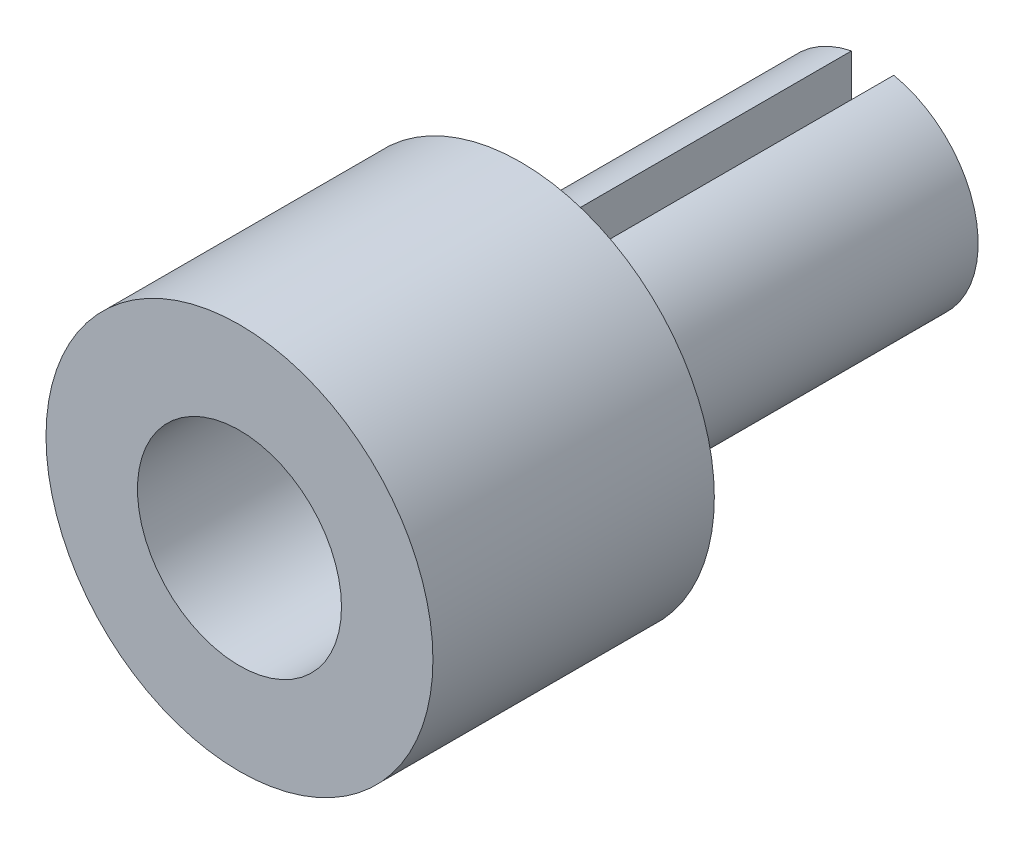
ISO-10303-21;
HEADER;
FILE_DESCRIPTION(('STEP AP214'),'2;1');
FILE_NAME('part.step','',(''),(''),'','','');
FILE_SCHEMA(('AUTOMOTIVE_DESIGN { 1 0 10303 214 1 1 1 1 }'));
ENDSEC;
DATA;
#1=APPLICATION_CONTEXT('core data for automotive mechanical design processes');
#2=APPLICATION_PROTOCOL_DEFINITION('international standard','automotive_design',2000,#1);
#3=PRODUCT_CONTEXT('',#1,'mechanical');
#4=PRODUCT('Part','Part','',(#3));
#5=PRODUCT_RELATED_PRODUCT_CATEGORY('part','',(#4));
#6=PRODUCT_DEFINITION_FORMATION('','',#4);
#7=PRODUCT_DEFINITION_CONTEXT('part definition',#1,'design');
#8=PRODUCT_DEFINITION('design','',#6,#7);
#9=PRODUCT_DEFINITION_SHAPE('','',#8);
#10=(LENGTH_UNIT() NAMED_UNIT(*) SI_UNIT(.MILLI.,.METRE.));
#11=(NAMED_UNIT(*) PLANE_ANGLE_UNIT() SI_UNIT($,.RADIAN.));
#12=(NAMED_UNIT(*) SI_UNIT($,.STERADIAN.) SOLID_ANGLE_UNIT());
#13=UNCERTAINTY_MEASURE_WITH_UNIT(LENGTH_MEASURE(1.E-05),#10,'distance_accuracy_value','');
#14=(GEOMETRIC_REPRESENTATION_CONTEXT(3) GLOBAL_UNCERTAINTY_ASSIGNED_CONTEXT((#13)) GLOBAL_UNIT_ASSIGNED_CONTEXT((#10,
#11,#12)) REPRESENTATION_CONTEXT('',''));
#15=CARTESIAN_POINT('',(0.,0.,0.));
#16=DIRECTION('',(0.,0.,1.));
#17=DIRECTION('',(1.,0.,0.));
#18=AXIS2_PLACEMENT_3D('',#15,#16,#17);
#19=CARTESIAN_POINT('',(10.,0.,0.999999999999999));
#20=DIRECTION('',(0.,0.,1.));
#21=DIRECTION('',(1.,0.,0.));
#22=AXIS2_PLACEMENT_3D('',#19,#20,#21);
#23=CYLINDRICAL_SURFACE('',#22,5.5);
#24=CARTESIAN_POINT('',(10.,0.,0.999999999999999));
#25=DIRECTION('',(0.,0.,-1.));
#26=DIRECTION('',(-1.,0.,0.));
#27=AXIS2_PLACEMENT_3D('',#24,#25,#26);
#28=CIRCLE('',#27,5.5);
#29=CARTESIAN_POINT('',(4.5,0.,0.999999999999999));
#30=VERTEX_POINT('',#29);
#31=EDGE_CURVE('E152',#30,#30,#28,.T.);
#32=ORIENTED_EDGE('',*,*,#31,.F.);
#33=EDGE_LOOP('',(#32));
#34=FACE_BOUND('',#33,.T.);
#35=CARTESIAN_POINT('',(10.,0.,9.));
#36=DIRECTION('',(0.,0.,-1.));
#37=DIRECTION('',(-1.,0.,0.));
#38=AXIS2_PLACEMENT_3D('',#35,#36,#37);
#39=CIRCLE('',#38,5.5);
#40=CARTESIAN_POINT('',(4.5,0.,9.));
#41=VERTEX_POINT('',#40);
#42=EDGE_CURVE('E151',#41,#41,#39,.T.);
#43=ORIENTED_EDGE('',*,*,#42,.T.);
#44=EDGE_LOOP('',(#43));
#45=FACE_BOUND('',#44,.T.);
#46=ADVANCED_FACE('F57',(#34,#45),#23,.T.);
#47=CARTESIAN_POINT('',(10.,0.,0.999999999999999));
#48=DIRECTION('',(0.,0.,-1.));
#49=DIRECTION('',(-1.,0.,0.));
#50=AXIS2_PLACEMENT_3D('',#47,#48,#49);
#51=PLANE('',#50);
#52=CARTESIAN_POINT('',(10.,0.,0.999999999999999));
#53=DIRECTION('',(0.,0.,-1.));
#54=DIRECTION('',(-1.,0.,0.));
#55=AXIS2_PLACEMENT_3D('',#52,#53,#54);
#56=CIRCLE('',#55,3.2);
#57=CARTESIAN_POINT('',(10.,-3.2,0.999999999999999));
#58=VERTEX_POINT('',#57);
#59=CARTESIAN_POINT('',(10.,3.2,0.999999999999999));
#60=VERTEX_POINT('',#59);
#61=EDGE_CURVE('E165',#58,#60,#56,.F.);
#62=ORIENTED_EDGE('',*,*,#61,.T.);
#63=CARTESIAN_POINT('',(10.,0.,0.999999999999999));
#64=DIRECTION('',(0.,0.,-1.));
#65=DIRECTION('',(-1.,0.,0.));
#66=AXIS2_PLACEMENT_3D('',#63,#64,#65);
#67=CIRCLE('',#66,3.2);
#68=EDGE_CURVE('E161',#60,#58,#67,.F.);
#69=ORIENTED_EDGE('',*,*,#68,.T.);
#70=EDGE_LOOP('',(#62,#69));
#71=FACE_BOUND('',#70,.T.);
#72=ORIENTED_EDGE('',*,*,#31,.T.);
#73=EDGE_LOOP('',(#72));
#74=FACE_BOUND('',#73,.T.);
#75=ADVANCED_FACE('F260',(#71,#74),#51,.T.);
#76=CARTESIAN_POINT('',(10.,0.,9.));
#77=DIRECTION('',(0.,0.,-1.));
#78=DIRECTION('',(-1.,0.,0.));
#79=AXIS2_PLACEMENT_3D('',#76,#77,#78);
#80=PLANE('',#79);
#81=CARTESIAN_POINT('',(10.,0.,9.));
#82=DIRECTION('',(0.,0.,1.));
#83=DIRECTION('',(1.,0.,0.));
#84=AXIS2_PLACEMENT_3D('',#81,#82,#83);
#85=CIRCLE('',#84,2.9);
#86=CARTESIAN_POINT('',(12.9,0.,9.));
#87=VERTEX_POINT('',#86);
#88=EDGE_CURVE('E401',#87,#87,#85,.T.);
#89=ORIENTED_EDGE('',*,*,#88,.F.);
#90=EDGE_LOOP('',(#89));
#91=FACE_BOUND('',#90,.T.);
#92=ORIENTED_EDGE('',*,*,#42,.F.);
#93=EDGE_LOOP('',(#92));
#94=FACE_BOUND('',#93,.T.);
#95=ADVANCED_FACE('F262',(#91,#94),#80,.F.);
#96=CARTESIAN_POINT('',(9.4,0.,-9.));
#97=DIRECTION('',(-1.,0.,0.));
#98=DIRECTION('',(0.,0.,1.));
#99=AXIS2_PLACEMENT_3D('',#96,#97,#98);
#100=PLANE('',#99);
#101=DIRECTION('',(0.,0.,1.));
#102=VECTOR('',#101,1.);
#103=CARTESIAN_POINT('',(9.4,2.93938769133981,-9.));
#104=LINE('',#103,#102);
#105=CARTESIAN_POINT('',(9.4,2.93938769133981,-9.));
#106=VERTEX_POINT('',#105);
#107=CARTESIAN_POINT('',(9.4,2.93938769133981,0.399999999999999));
#108=VERTEX_POINT('',#107);
#109=EDGE_CURVE('E143',#106,#108,#104,.T.);
#110=ORIENTED_EDGE('',*,*,#109,.T.);
#111=DIRECTION('',(0.,-1.,0.));
#112=VECTOR('',#111,1.);
#113=CARTESIAN_POINT('',(9.4,0.,0.399999999999999));
#114=LINE('',#113,#112);
#115=CARTESIAN_POINT('',(9.4,-2.93938769133982,0.399999999999999));
#116=VERTEX_POINT('',#115);
#117=EDGE_CURVE('E171',#108,#116,#114,.T.);
#118=ORIENTED_EDGE('',*,*,#117,.T.);
#119=DIRECTION('',(0.,0.,1.));
#120=VECTOR('',#119,1.);
#121=CARTESIAN_POINT('',(9.4,-2.93938769133982,-9.));
#122=LINE('',#121,#120);
#123=CARTESIAN_POINT('',(9.4,-2.93938769133982,-9.));
#124=VERTEX_POINT('',#123);
#125=EDGE_CURVE('E147',#124,#116,#122,.T.);
#126=ORIENTED_EDGE('',*,*,#125,.F.);
#127=DIRECTION('',(0.,-1.,0.));
#128=VECTOR('',#127,1.);
#129=CARTESIAN_POINT('',(9.4,0.,-9.));
#130=LINE('',#129,#128);
#131=EDGE_CURVE('E135',#106,#124,#130,.T.);
#132=ORIENTED_EDGE('',*,*,#131,.F.);
#133=EDGE_LOOP('',(#110,#118,#126,#132));
#134=FACE_BOUND('',#133,.T.);
#135=ADVANCED_FACE('F265',(#134),#100,.F.);
#136=CARTESIAN_POINT('',(10.,0.,-9.));
#137=DIRECTION('',(0.,0.,1.));
#138=DIRECTION('',(1.,0.,0.));
#139=AXIS2_PLACEMENT_3D('',#136,#137,#138);
#140=CYLINDRICAL_SURFACE('',#139,3.);
#141=ORIENTED_EDGE('',*,*,#125,.T.);
#142=CARTESIAN_POINT('',(9.4,-2.93938769133982,0.399999999999999));
#143=CARTESIAN_POINT('',(9.3999687418093,-2.93936518394346,0.433360551809369));
#144=CARTESIAN_POINT('',(9.40277992227454,-2.93995496401104,0.466706403486926));
#145=CARTESIAN_POINT('',(9.41386385694671,-2.94219328989964,0.53246197758734));
#146=CARTESIAN_POINT('',(9.422139482854,-2.94384239240823,0.564871198435304));
#147=CARTESIAN_POINT('',(9.44393153779739,-2.94803379990803,0.627818337847222));
#148=CARTESIAN_POINT('',(9.45744939717512,-2.95057634865796,0.658355743051161));
#149=CARTESIAN_POINT('',(9.48929643563222,-2.95625492194706,0.716670932051555));
#150=CARTESIAN_POINT('',(9.50761441192486,-2.9593895599402,0.744454936490346));
#151=CARTESIAN_POINT('',(9.53599053506304,-2.96390943206666,0.780606954961522));
#152=CARTESIAN_POINT('',(9.54423648289585,-2.9651903088908,0.790444702450846));
#153=CARTESIAN_POINT('',(9.55278640450004,-2.96647939483827,0.799999999999999));
#154=B_SPLINE_CURVE_WITH_KNOTS('',3,(#142,#143,#144,#145,#146,#147,#148,#149,#150,#151,#152,
#153),.UNSPECIFIED.,.F.,.F.,(4,2,2,2,2,4),(0.,0.099936791068292,0.19992614321977,
0.299942796649393,0.399728072895411,0.438400207243827),.UNSPECIFIED.);
#155=CARTESIAN_POINT('',(9.55278640450004,-2.96647939483827,0.799999999999999));
#156=VERTEX_POINT('',#155);
#157=EDGE_CURVE('E178',#116,#156,#154,.T.);
#158=ORIENTED_EDGE('',*,*,#157,.T.);
#159=CARTESIAN_POINT('',(10.,0.,0.799999999999999));
#160=DIRECTION('',(0.,0.,-1.));
#161=DIRECTION('',(-1.,0.,0.));
#162=AXIS2_PLACEMENT_3D('',#159,#160,#161);
#163=CIRCLE('',#162,3.);
#164=CARTESIAN_POINT('',(9.55278640450004,2.96647939483827,0.799999999999999));
#165=VERTEX_POINT('',#164);
#166=EDGE_CURVE('E168',#156,#165,#163,.T.);
#167=ORIENTED_EDGE('',*,*,#166,.T.);
#168=CARTESIAN_POINT('',(9.55278640450004,2.96647939483827,0.799999999999999));
#169=CARTESIAN_POINT('',(9.53042772305833,2.96310338419509,0.775042880070899));
#170=CARTESIAN_POINT('',(9.5101944090678,2.95979893442571,0.748172961665765));
#171=CARTESIAN_POINT('',(9.47441511024872,2.95365878628338,0.69134415154967));
#172=CARTESIAN_POINT('',(9.45887941477475,2.95082412294504,0.661378669243984));
#173=CARTESIAN_POINT('',(9.43301900781175,2.94596406138184,0.599176324228426));
#174=CARTESIAN_POINT('',(9.4227001029054,2.94393956543898,0.566936975841153));
#175=CARTESIAN_POINT('',(9.40764417994576,2.9409483248328,0.5012150949061));
#176=CARTESIAN_POINT('',(9.40289027583287,2.93997838094992,0.467736642837614));
#177=CARTESIAN_POINT('',(9.40032230832569,2.9394530168592,0.422759628621787));
#178=CARTESIAN_POINT('',(9.39999759084003,2.93938628444403,0.411376911916186));
#179=CARTESIAN_POINT('',(9.4,2.93938769133982,0.399999999999999));
#180=B_SPLINE_CURVE_WITH_KNOTS('',3,(#168,#169,#170,#171,#172,#173,#174,#175,#176,#177,#178,
#179),.UNSPECIFIED.,.F.,.F.,(4,2,2,2,2,4),(0.,0.100917908844464,0.202055286612998,
0.303304989512898,0.404246664243495,0.438388440221177),.UNSPECIFIED.);
#181=EDGE_CURVE('E217',#165,#108,#180,.T.);
#182=ORIENTED_EDGE('',*,*,#181,.T.);
#183=ORIENTED_EDGE('',*,*,#109,.F.);
#184=CARTESIAN_POINT('',(10.,0.,-9.));
#185=DIRECTION('',(0.,0.,-1.));
#186=DIRECTION('',(-1.,0.,0.));
#187=AXIS2_PLACEMENT_3D('',#184,#185,#186);
#188=CIRCLE('',#187,3.);
#189=EDGE_CURVE('E138',#124,#106,#188,.T.);
#190=ORIENTED_EDGE('',*,*,#189,.F.);
#191=EDGE_LOOP('',(#141,#158,#167,#182,#183,#190));
#192=FACE_BOUND('',#191,.T.);
#193=ADVANCED_FACE('F194',(#192),#140,.T.);
#194=CARTESIAN_POINT('',(10.,0.,-9.));
#195=DIRECTION('',(0.,0.,-1.));
#196=DIRECTION('',(-1.,0.,0.));
#197=AXIS2_PLACEMENT_3D('',#194,#195,#196);
#198=PLANE('',#197);
#199=ORIENTED_EDGE('',*,*,#131,.T.);
#200=ORIENTED_EDGE('',*,*,#189,.T.);
#201=EDGE_LOOP('',(#199,#200));
#202=FACE_BOUND('',#201,.T.);
#203=ADVANCED_FACE('F274',(#202),#198,.T.);
#204=CARTESIAN_POINT('',(10.6,0.,-9.));
#205=DIRECTION('',(1.,0.,0.));
#206=DIRECTION('',(0.,0.,-1.));
#207=AXIS2_PLACEMENT_3D('',#204,#205,#206);
#208=PLANE('',#207);
#209=DIRECTION('',(0.,0.,1.));
#210=VECTOR('',#209,1.);
#211=CARTESIAN_POINT('',(10.6,-2.93938769133981,-9.));
#212=LINE('',#211,#210);
#213=CARTESIAN_POINT('',(10.6,-2.93938769133981,-9.));
#214=VERTEX_POINT('',#213);
#215=CARTESIAN_POINT('',(10.6,-2.93938769133981,0.399999999999999));
#216=VERTEX_POINT('',#215);
#217=EDGE_CURVE('E123',#214,#216,#212,.T.);
#218=ORIENTED_EDGE('',*,*,#217,.T.);
#219=DIRECTION('',(0.,1.,0.));
#220=VECTOR('',#219,1.);
#221=CARTESIAN_POINT('',(10.6,0.,0.399999999999999));
#222=LINE('',#221,#220);
#223=CARTESIAN_POINT('',(10.6,2.93938769133981,0.399999999999999));
#224=VERTEX_POINT('',#223);
#225=EDGE_CURVE('E175',#216,#224,#222,.T.);
#226=ORIENTED_EDGE('',*,*,#225,.T.);
#227=DIRECTION('',(0.,0.,1.));
#228=VECTOR('',#227,1.);
#229=CARTESIAN_POINT('',(10.6,2.93938769133981,-9.));
#230=LINE('',#229,#228);
#231=CARTESIAN_POINT('',(10.6,2.93938769133981,-9.));
#232=VERTEX_POINT('',#231);
#233=EDGE_CURVE('E131',#232,#224,#230,.T.);
#234=ORIENTED_EDGE('',*,*,#233,.F.);
#235=DIRECTION('',(0.,1.,0.));
#236=VECTOR('',#235,1.);
#237=CARTESIAN_POINT('',(10.6,0.,-9.));
#238=LINE('',#237,#236);
#239=EDGE_CURVE('E119',#214,#232,#238,.T.);
#240=ORIENTED_EDGE('',*,*,#239,.F.);
#241=EDGE_LOOP('',(#218,#226,#234,#240));
#242=FACE_BOUND('',#241,.T.);
#243=ADVANCED_FACE('F133',(#242),#208,.F.);
#244=CARTESIAN_POINT('',(10.,0.,-9.));
#245=DIRECTION('',(0.,0.,1.));
#246=DIRECTION('',(1.,0.,0.));
#247=AXIS2_PLACEMENT_3D('',#244,#245,#246);
#248=CYLINDRICAL_SURFACE('',#247,3.);
#249=ORIENTED_EDGE('',*,*,#233,.T.);
#250=CARTESIAN_POINT('',(10.6,2.93938769133981,0.399999999999999));
#251=CARTESIAN_POINT('',(10.6000312581907,2.93936518394346,0.433360551809369));
#252=CARTESIAN_POINT('',(10.5972200777255,2.93995496401104,0.466706403486925));
#253=CARTESIAN_POINT('',(10.5861361430533,2.94219328989964,0.532461977587339));
#254=CARTESIAN_POINT('',(10.577860517146,2.94384239240823,0.564871198435304));
#255=CARTESIAN_POINT('',(10.5560684622026,2.94803379990803,0.627818337847222));
#256=CARTESIAN_POINT('',(10.5425506028249,2.95057634865796,0.658355743051161));
#257=CARTESIAN_POINT('',(10.5107035643678,2.95625492194706,0.716670932051555));
#258=CARTESIAN_POINT('',(10.4923855880751,2.9593895599402,0.744454936490346));
#259=CARTESIAN_POINT('',(10.464009464937,2.96390943206666,0.780606954961522));
#260=CARTESIAN_POINT('',(10.4557635171041,2.9651903088908,0.790444702450846));
#261=CARTESIAN_POINT('',(10.4472135955,2.96647939483827,0.799999999999999));
#262=B_SPLINE_CURVE_WITH_KNOTS('',3,(#250,#251,#252,#253,#254,#255,#256,#257,#258,#259,#260,
#261),.UNSPECIFIED.,.F.,.F.,(4,2,2,2,2,4),(0.,0.0999367910682915,0.19992614321977,
0.299942796649393,0.399728072895411,0.438400207243827),.UNSPECIFIED.);
#263=CARTESIAN_POINT('',(10.4472135955,2.96647939483827,0.799999999999999));
#264=VERTEX_POINT('',#263);
#265=EDGE_CURVE('E224',#224,#264,#262,.T.);
#266=ORIENTED_EDGE('',*,*,#265,.T.);
#267=CARTESIAN_POINT('',(10.,0.,0.799999999999999));
#268=DIRECTION('',(0.,0.,-1.));
#269=DIRECTION('',(-1.,0.,0.));
#270=AXIS2_PLACEMENT_3D('',#267,#268,#269);
#271=CIRCLE('',#270,3.);
#272=CARTESIAN_POINT('',(10.4472135955,-2.96647939483827,0.799999999999999));
#273=VERTEX_POINT('',#272);
#274=EDGE_CURVE('E74',#264,#273,#271,.T.);
#275=ORIENTED_EDGE('',*,*,#274,.T.);
#276=CARTESIAN_POINT('',(10.4472135955,-2.96647939483827,0.799999999999999));
#277=CARTESIAN_POINT('',(10.4695722769417,-2.96310338419509,0.775042880070898));
#278=CARTESIAN_POINT('',(10.4898055909322,-2.95979893442571,0.748172961665765));
#279=CARTESIAN_POINT('',(10.5255848897513,-2.95365878628338,0.69134415154967));
#280=CARTESIAN_POINT('',(10.5411205852253,-2.95082412294504,0.661378669243984));
#281=CARTESIAN_POINT('',(10.5669809921883,-2.94596406138184,0.599176324228426));
#282=CARTESIAN_POINT('',(10.5772998970946,-2.94393956543898,0.566936975841153));
#283=CARTESIAN_POINT('',(10.5923558200542,-2.9409483248328,0.501215094906101));
#284=CARTESIAN_POINT('',(10.5971097241671,-2.93997838094992,0.467736642837614));
#285=CARTESIAN_POINT('',(10.5996776916743,-2.9394530168592,0.422759628621787));
#286=CARTESIAN_POINT('',(10.60000240916,-2.93938628444403,0.411376911916186));
#287=CARTESIAN_POINT('',(10.6,-2.93938769133982,0.399999999999999));
#288=B_SPLINE_CURVE_WITH_KNOTS('',3,(#276,#277,#278,#279,#280,#281,#282,#283,#284,#285,#286,
#287),.UNSPECIFIED.,.F.,.F.,(4,2,2,2,2,4),(0.,0.100917908844464,0.202055286612998,
0.303304989512897,0.404246664243495,0.438388440221177),.UNSPECIFIED.);
#289=EDGE_CURVE('E11',#273,#216,#288,.T.);
#290=ORIENTED_EDGE('',*,*,#289,.T.);
#291=ORIENTED_EDGE('',*,*,#217,.F.);
#292=CARTESIAN_POINT('',(10.,0.,-9.));
#293=DIRECTION('',(0.,0.,-1.));
#294=DIRECTION('',(-1.,0.,0.));
#295=AXIS2_PLACEMENT_3D('',#292,#293,#294);
#296=CIRCLE('',#295,3.);
#297=EDGE_CURVE('E115',#232,#214,#296,.T.);
#298=ORIENTED_EDGE('',*,*,#297,.F.);
#299=EDGE_LOOP('',(#249,#266,#275,#290,#291,#298));
#300=FACE_BOUND('',#299,.T.);
#301=ADVANCED_FACE('F126',(#300),#248,.T.);
#302=CARTESIAN_POINT('',(10.,0.,-9.));
#303=DIRECTION('',(0.,0.,-1.));
#304=DIRECTION('',(-1.,0.,0.));
#305=AXIS2_PLACEMENT_3D('',#302,#303,#304);
#306=PLANE('',#305);
#307=ORIENTED_EDGE('',*,*,#239,.T.);
#308=ORIENTED_EDGE('',*,*,#297,.T.);
#309=EDGE_LOOP('',(#307,#308));
#310=FACE_BOUND('',#309,.T.);
#311=ADVANCED_FACE('F117',(#310),#306,.T.);
#312=CARTESIAN_POINT('',(10.,0.,0.799999999999999));
#313=DIRECTION('',(0.,0.,-1.));
#314=DIRECTION('',(-1.,0.,0.));
#315=AXIS2_PLACEMENT_3D('',#312,#313,#314);
#316=TOROIDAL_SURFACE('',#315,3.2,0.2);
#317=ORIENTED_EDGE('',*,*,#274,.F.);
#318=CARTESIAN_POINT('',(10.4472135955,2.96647939483827,0.799999999999999));
#319=CARTESIAN_POINT('',(10.4401260689223,2.96755219765248,0.807925467832615));
#320=CARTESIAN_POINT('',(10.4328680190847,2.96909193146987,0.815614961672288));
#321=CARTESIAN_POINT('',(10.4180786400435,2.97295194157825,0.8304877420642));
#322=CARTESIAN_POINT('',(10.4105479661065,2.97527044447629,0.837672134269581));
#323=CARTESIAN_POINT('',(10.3877444687367,2.98312594094811,0.85833669824765));
#324=CARTESIAN_POINT('',(10.372123606491,2.98958907816656,0.871079291638695));
#325=CARTESIAN_POINT('',(10.3309265469602,3.00840648722702,0.901471651737672));
#326=CARTESIAN_POINT('',(10.3048522094226,3.02199924559744,0.917655498594793));
#327=CARTESIAN_POINT('',(10.2514389521826,3.05143025691542,0.945613136782167));
#328=CARTESIAN_POINT('',(10.2240926113403,3.06728321337191,0.957356050522503));
#329=CARTESIAN_POINT('',(10.1651161848978,3.10207316876989,0.977778228494754));
#330=CARTESIAN_POINT('',(10.1333754614473,3.12114881045272,0.985896875740952));
#331=CARTESIAN_POINT('',(10.069230086069,3.15945855124277,0.996875721640741));
#332=CARTESIAN_POINT('',(10.0368282565943,3.17869182573421,0.999754867456724));
#333=CARTESIAN_POINT('',(10.0028279664408,3.19836633762406,0.999994990804822));
#334=CARTESIAN_POINT('',(10.0014141489875,3.19918354314595,0.999999989352348));
#335=CARTESIAN_POINT('',(10.,3.2,0.999999999999999));
#336=B_SPLINE_CURVE_WITH_KNOTS('',3,(#318,#319,#320,#321,#322,#323,#324,#325,#326,#327,#328,
#329,#330,#331,#332,#333,#334,#335),.UNSPECIFIED.,.F.,.F.,(4,2,2,2,2,2,2,2,4),(0.,
0.0320220374736961,0.0639716440425218,0.127262828572128,0.227425628581126,0.328272582732639,
0.441627350361007,0.554571382008605,0.559470385025209),.UNSPECIFIED.);
#337=EDGE_CURVE('E232',#264,#60,#336,.T.);
#338=ORIENTED_EDGE('',*,*,#337,.T.);
#339=ORIENTED_EDGE('',*,*,#61,.F.);
#340=CARTESIAN_POINT('',(10.4472135955,-2.96647939483827,0.799999999999999));
#341=CARTESIAN_POINT('',(10.4401260689223,-2.96755219765248,0.807925467832615));
#342=CARTESIAN_POINT('',(10.4328680190847,-2.96909193146987,0.815614961672288));
#343=CARTESIAN_POINT('',(10.4180786400435,-2.97295194157825,0.8304877420642));
#344=CARTESIAN_POINT('',(10.4105479661065,-2.97527044447629,0.837672134269581));
#345=CARTESIAN_POINT('',(10.3877444687367,-2.98312594094811,0.85833669824765));
#346=CARTESIAN_POINT('',(10.372123606491,-2.98958907816656,0.871079291638695));
#347=CARTESIAN_POINT('',(10.3309265469602,-3.00840648722702,0.901471651737672));
#348=CARTESIAN_POINT('',(10.3048522094226,-3.02199924559744,0.917655498594793));
#349=CARTESIAN_POINT('',(10.2514389521826,-3.05143025691542,0.945613136782167));
#350=CARTESIAN_POINT('',(10.2240926113403,-3.06728321337191,0.957356050522503));
#351=CARTESIAN_POINT('',(10.1651161848978,-3.10207316876989,0.977778228494754));
#352=CARTESIAN_POINT('',(10.1333754614473,-3.12114881045271,0.985896875740952));
#353=CARTESIAN_POINT('',(10.069230086069,-3.15945855124277,0.996875721640741));
#354=CARTESIAN_POINT('',(10.0368282565943,-3.17869182573422,0.999754867456724));
#355=CARTESIAN_POINT('',(10.0028279664408,-3.19836633762406,0.999994990804822));
#356=CARTESIAN_POINT('',(10.0014141489875,-3.19918354314595,0.999999989352348));
#357=CARTESIAN_POINT('',(10.,-3.2,0.999999999999999));
#358=B_SPLINE_CURVE_WITH_KNOTS('',3,(#340,#341,#342,#343,#344,#345,#346,#347,#348,#349,#350,
#351,#352,#353,#354,#355,#356,#357),.UNSPECIFIED.,.F.,.F.,(4,2,2,2,2,2,2,2,4),(0.,
0.0320220374736959,0.0639716440425216,0.127262828572127,0.227425628581126,0.32827258273264,
0.441627350361008,0.554571382008603,0.55947038502521),.UNSPECIFIED.);
#359=EDGE_CURVE('E68',#58,#273,#358,.F.);
#360=ORIENTED_EDGE('',*,*,#359,.T.);
#361=EDGE_LOOP('',(#317,#338,#339,#360));
#362=FACE_BOUND('',#361,.T.);
#363=ADVANCED_FACE('F253',(#362),#316,.F.);
#364=CARTESIAN_POINT('',(10.,0.,0.799999999999999));
#365=DIRECTION('',(0.,0.,-1.));
#366=DIRECTION('',(-1.,0.,0.));
#367=AXIS2_PLACEMENT_3D('',#364,#365,#366);
#368=TOROIDAL_SURFACE('',#367,3.2,0.2);
#369=ORIENTED_EDGE('',*,*,#166,.F.);
#370=CARTESIAN_POINT('',(9.55278640450004,-2.96647939483827,0.799999999999999));
#371=CARTESIAN_POINT('',(9.55987393107773,-2.96755219765248,0.807925467832615));
#372=CARTESIAN_POINT('',(9.56713198091531,-2.96909193146987,0.815614961672288));
#373=CARTESIAN_POINT('',(9.58192135995652,-2.97295194157825,0.8304877420642));
#374=CARTESIAN_POINT('',(9.5894520338935,-2.97527044447629,0.837672134269582));
#375=CARTESIAN_POINT('',(9.61225553126326,-2.98312594094811,0.85833669824765));
#376=CARTESIAN_POINT('',(9.62787639350898,-2.98958907816656,0.871079291638695));
#377=CARTESIAN_POINT('',(9.66907345303982,-3.00840648722702,0.901471651737672));
#378=CARTESIAN_POINT('',(9.69514779057738,-3.02199924559744,0.917655498594792));
#379=CARTESIAN_POINT('',(9.74856104781738,-3.05143025691542,0.945613136782167));
#380=CARTESIAN_POINT('',(9.77590738865972,-3.06728321337191,0.957356050522503));
#381=CARTESIAN_POINT('',(9.83488381510217,-3.10207316876989,0.977778228494754));
#382=CARTESIAN_POINT('',(9.86662453855274,-3.12114881045272,0.985896875740952));
#383=CARTESIAN_POINT('',(9.93076991393104,-3.15945855124277,0.996875721640741));
#384=CARTESIAN_POINT('',(9.96317174340569,-3.17869182573421,0.999754867456724));
#385=CARTESIAN_POINT('',(9.99717203355925,-3.19836633762406,0.999994990804822));
#386=CARTESIAN_POINT('',(9.99858585101247,-3.19918354314595,0.999999989352348));
#387=CARTESIAN_POINT('',(10.,-3.2,0.999999999999999));
#388=B_SPLINE_CURVE_WITH_KNOTS('',3,(#370,#371,#372,#373,#374,#375,#376,#377,#378,#379,#380,
#381,#382,#383,#384,#385,#386,#387),.UNSPECIFIED.,.F.,.F.,(4,2,2,2,2,2,2,2,4),(0.,
0.0320220374736978,0.0639716440425218,0.127262828572127,0.227425628581124,0.32827258273264,
0.441627350361009,0.554571382008604,0.559470385025209),.UNSPECIFIED.);
#389=EDGE_CURVE('E187',#156,#58,#388,.T.);
#390=ORIENTED_EDGE('',*,*,#389,.T.);
#391=ORIENTED_EDGE('',*,*,#68,.F.);
#392=CARTESIAN_POINT('',(9.55278640450004,2.96647939483827,0.799999999999999));
#393=CARTESIAN_POINT('',(9.55987393107773,2.96755219765248,0.807925467832615));
#394=CARTESIAN_POINT('',(9.56713198091531,2.96909193146987,0.815614961672288));
#395=CARTESIAN_POINT('',(9.58192135995652,2.97295194157825,0.8304877420642));
#396=CARTESIAN_POINT('',(9.5894520338935,2.97527044447629,0.837672134269582));
#397=CARTESIAN_POINT('',(9.61225553126326,2.98312594094811,0.85833669824765));
#398=CARTESIAN_POINT('',(9.62787639350898,2.98958907816656,0.871079291638695));
#399=CARTESIAN_POINT('',(9.66907345303982,3.00840648722702,0.901471651737672));
#400=CARTESIAN_POINT('',(9.69514779057738,3.02199924559744,0.917655498594792));
#401=CARTESIAN_POINT('',(9.74856104781738,3.05143025691542,0.945613136782167));
#402=CARTESIAN_POINT('',(9.77590738865972,3.06728321337191,0.957356050522503));
#403=CARTESIAN_POINT('',(9.83488381510217,3.10207316876989,0.977778228494754));
#404=CARTESIAN_POINT('',(9.86662453855274,3.12114881045272,0.985896875740952));
#405=CARTESIAN_POINT('',(9.93076991393104,3.15945855124277,0.996875721640741));
#406=CARTESIAN_POINT('',(9.96317174340569,3.17869182573421,0.999754867456724));
#407=CARTESIAN_POINT('',(9.99717203355925,3.19836633762406,0.999994990804822));
#408=CARTESIAN_POINT('',(9.99858585101247,3.19918354314595,0.999999989352348));
#409=CARTESIAN_POINT('',(10.,3.2,0.999999999999999));
#410=B_SPLINE_CURVE_WITH_KNOTS('',3,(#392,#393,#394,#395,#396,#397,#398,#399,#400,#401,#402,
#403,#404,#405,#406,#407,#408,#409),.UNSPECIFIED.,.F.,.F.,(4,2,2,2,2,2,2,2,4),(0.,
0.0320220374736978,0.0639716440425218,0.127262828572127,0.227425628581124,0.32827258273264,
0.441627350361009,0.554571382008604,0.559470385025209),.UNSPECIFIED.);
#411=EDGE_CURVE('E210',#60,#165,#410,.F.);
#412=ORIENTED_EDGE('',*,*,#411,.T.);
#413=EDGE_LOOP('',(#369,#390,#391,#412));
#414=FACE_BOUND('',#413,.T.);
#415=ADVANCED_FACE('F203',(#414),#368,.F.);
#416=CARTESIAN_POINT('',(10.,0.,0.399999999999999));
#417=DIRECTION('',(0.,1.,0.));
#418=DIRECTION('',(0.,0.,1.));
#419=AXIS2_PLACEMENT_3D('',#416,#417,#418);
#420=CYLINDRICAL_SURFACE('',#419,0.6);
#421=DIRECTION('',(0.,1.,0.));
#422=VECTOR('',#421,1.);
#423=CARTESIAN_POINT('',(10.,0.,0.999999999999999));
#424=LINE('',#423,#422);
#425=EDGE_CURVE('E62',#60,#58,#424,.F.);
#426=ORIENTED_EDGE('',*,*,#425,.F.);
#427=ORIENTED_EDGE('',*,*,#337,.F.);
#428=ORIENTED_EDGE('',*,*,#265,.F.);
#429=ORIENTED_EDGE('',*,*,#225,.F.);
#430=ORIENTED_EDGE('',*,*,#289,.F.);
#431=ORIENTED_EDGE('',*,*,#359,.F.);
#432=EDGE_LOOP('',(#426,#427,#428,#429,#430,#431));
#433=FACE_BOUND('',#432,.T.);
#434=ADVANCED_FACE('F59',(#433),#420,.F.);
#435=CARTESIAN_POINT('',(10.,0.,0.399999999999999));
#436=DIRECTION('',(0.,-1.,0.));
#437=DIRECTION('',(0.,0.,-1.));
#438=AXIS2_PLACEMENT_3D('',#435,#436,#437);
#439=CYLINDRICAL_SURFACE('',#438,0.6);
#440=ORIENTED_EDGE('',*,*,#411,.F.);
#441=ORIENTED_EDGE('',*,*,#425,.T.);
#442=ORIENTED_EDGE('',*,*,#389,.F.);
#443=ORIENTED_EDGE('',*,*,#157,.F.);
#444=ORIENTED_EDGE('',*,*,#117,.F.);
#445=ORIENTED_EDGE('',*,*,#181,.F.);
#446=EDGE_LOOP('',(#440,#441,#442,#443,#444,#445));
#447=FACE_BOUND('',#446,.T.);
#448=ADVANCED_FACE('F198',(#447),#439,.F.);
#449=CARTESIAN_POINT('',(10.,0.,3.));
#450=DIRECTION('',(0.,0.,1.));
#451=DIRECTION('',(1.,0.,0.));
#452=AXIS2_PLACEMENT_3D('',#449,#450,#451);
#453=CYLINDRICAL_SURFACE('',#452,2.9);
#454=CARTESIAN_POINT('',(10.,0.,3.));
#455=DIRECTION('',(0.,0.,1.));
#456=DIRECTION('',(1.,0.,0.));
#457=AXIS2_PLACEMENT_3D('',#454,#455,#456);
#458=CIRCLE('',#457,2.9);
#459=CARTESIAN_POINT('',(12.9,0.,3.));
#460=VERTEX_POINT('',#459);
#461=EDGE_CURVE('E399',#460,#460,#458,.T.);
#462=ORIENTED_EDGE('',*,*,#461,.F.);
#463=EDGE_LOOP('',(#462));
#464=FACE_BOUND('',#463,.T.);
#465=ORIENTED_EDGE('',*,*,#88,.T.);
#466=EDGE_LOOP('',(#465));
#467=FACE_BOUND('',#466,.T.);
#468=ADVANCED_FACE('F201',(#464,#467),#453,.F.);
#469=CARTESIAN_POINT('',(10.,0.,3.));
#470=DIRECTION('',(0.,0.,1.));
#471=DIRECTION('',(1.,0.,0.));
#472=AXIS2_PLACEMENT_3D('',#469,#470,#471);
#473=PLANE('',#472);
#474=ORIENTED_EDGE('',*,*,#461,.T.);
#475=EDGE_LOOP('',(#474));
#476=FACE_BOUND('',#475,.T.);
#477=ADVANCED_FACE('F338',(#476),#473,.T.);
#478=CLOSED_SHELL('',(#46,#75,#95,#135,#193,#203,#243,#301,#311,#363,#415,#434,#448,#468,#477));
#479=MANIFOLD_SOLID_BREP('B2',#478);
#480=ADVANCED_BREP_SHAPE_REPRESENTATION('',(#18,#479),#14);
#481=SHAPE_DEFINITION_REPRESENTATION(#9,#480);
ENDSEC;
END-ISO-10303-21;
